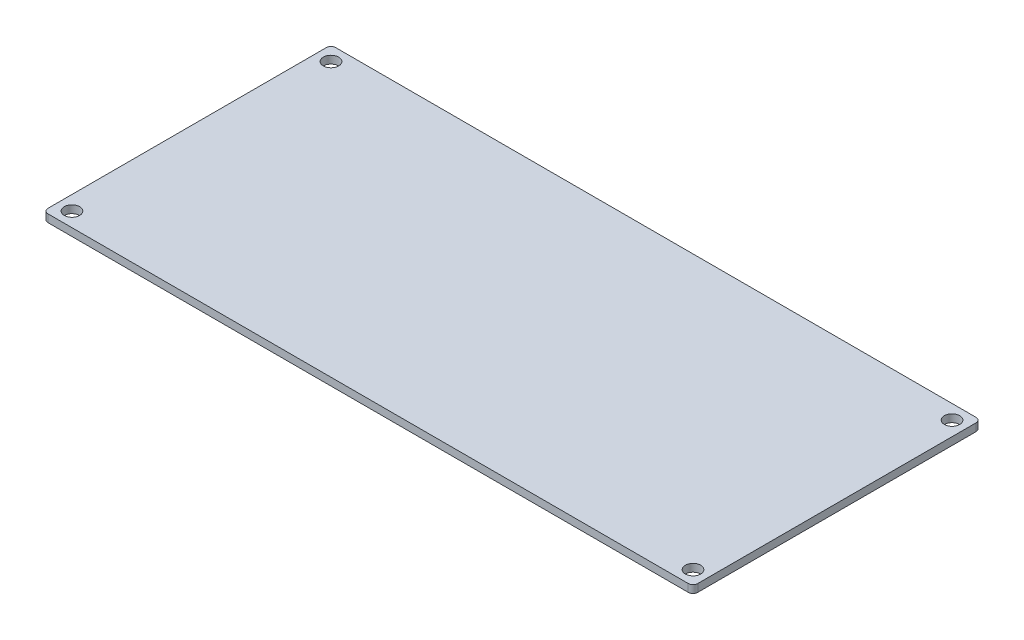
ISO-10303-21;
HEADER;
FILE_DESCRIPTION(('STEP AP214'),'2;1');
FILE_NAME('part.step','',(''),(''),'','','');
FILE_SCHEMA(('AUTOMOTIVE_DESIGN { 1 0 10303 214 1 1 1 1 }'));
ENDSEC;
DATA;
#1=APPLICATION_CONTEXT('core data for automotive mechanical design processes');
#2=APPLICATION_PROTOCOL_DEFINITION('international standard','automotive_design',2000,#1);
#3=PRODUCT_CONTEXT('',#1,'mechanical');
#4=PRODUCT('Part','Part','',(#3));
#5=PRODUCT_RELATED_PRODUCT_CATEGORY('part','',(#4));
#6=PRODUCT_DEFINITION_FORMATION('','',#4);
#7=PRODUCT_DEFINITION_CONTEXT('part definition',#1,'design');
#8=PRODUCT_DEFINITION('design','',#6,#7);
#9=PRODUCT_DEFINITION_SHAPE('','',#8);
#10=(LENGTH_UNIT() NAMED_UNIT(*) SI_UNIT(.MILLI.,.METRE.));
#11=(NAMED_UNIT(*) PLANE_ANGLE_UNIT() SI_UNIT($,.RADIAN.));
#12=(NAMED_UNIT(*) SI_UNIT($,.STERADIAN.) SOLID_ANGLE_UNIT());
#13=UNCERTAINTY_MEASURE_WITH_UNIT(LENGTH_MEASURE(1.E-05),#10,'distance_accuracy_value','');
#14=(GEOMETRIC_REPRESENTATION_CONTEXT(3) GLOBAL_UNCERTAINTY_ASSIGNED_CONTEXT((#13)) GLOBAL_UNIT_ASSIGNED_CONTEXT((#10,
#11,#12)) REPRESENTATION_CONTEXT('',''));
#15=CARTESIAN_POINT('',(0.,0.,0.));
#16=DIRECTION('',(0.,0.,1.));
#17=DIRECTION('',(1.,0.,0.));
#18=AXIS2_PLACEMENT_3D('',#15,#16,#17);
#19=CARTESIAN_POINT('',(67.735,1.6,-30.));
#20=DIRECTION('',(-1.,0.,0.));
#21=DIRECTION('',(0.,0.,1.));
#22=AXIS2_PLACEMENT_3D('',#19,#20,#21);
#23=PLANE('',#22);
#24=DIRECTION('',(0.,0.,-1.));
#25=VECTOR('',#24,1.);
#26=CARTESIAN_POINT('',(67.735,0.,-30.));
#27=LINE('',#26,#25);
#28=CARTESIAN_POINT('',(67.735,0.,29.));
#29=VERTEX_POINT('',#28);
#30=CARTESIAN_POINT('',(67.735,0.,-29.));
#31=VERTEX_POINT('',#30);
#32=EDGE_CURVE('E135',#29,#31,#27,.T.);
#33=ORIENTED_EDGE('',*,*,#32,.T.);
#34=DIRECTION('',(0.,-1.,0.));
#35=VECTOR('',#34,1.);
#36=CARTESIAN_POINT('',(67.735,1.6,-29.));
#37=LINE('',#36,#35);
#38=CARTESIAN_POINT('',(67.735,1.6,-29.));
#39=VERTEX_POINT('',#38);
#40=EDGE_CURVE('E109',#31,#39,#37,.F.);
#41=ORIENTED_EDGE('',*,*,#40,.T.);
#42=DIRECTION('',(0.,0.,-1.));
#43=VECTOR('',#42,1.);
#44=CARTESIAN_POINT('',(67.735,1.6,-30.));
#45=LINE('',#44,#43);
#46=CARTESIAN_POINT('',(67.735,1.6,29.));
#47=VERTEX_POINT('',#46);
#48=EDGE_CURVE('E142',#47,#39,#45,.T.);
#49=ORIENTED_EDGE('',*,*,#48,.F.);
#50=DIRECTION('',(0.,-1.,0.));
#51=VECTOR('',#50,1.);
#52=CARTESIAN_POINT('',(67.735,1.6,29.));
#53=LINE('',#52,#51);
#54=EDGE_CURVE('E113',#47,#29,#53,.T.);
#55=ORIENTED_EDGE('',*,*,#54,.T.);
#56=EDGE_LOOP('',(#33,#41,#49,#55));
#57=FACE_BOUND('',#56,.T.);
#58=ADVANCED_FACE('F39',(#57),#23,.F.);
#59=CARTESIAN_POINT('',(-67.735,1.6,-30.));
#60=DIRECTION('',(0.,0.,1.));
#61=DIRECTION('',(1.,0.,0.));
#62=AXIS2_PLACEMENT_3D('',#59,#60,#61);
#63=PLANE('',#62);
#64=DIRECTION('',(-1.,0.,0.));
#65=VECTOR('',#64,1.);
#66=CARTESIAN_POINT('',(-67.735,1.6,-30.));
#67=LINE('',#66,#65);
#68=CARTESIAN_POINT('',(66.735,1.6,-30.));
#69=VERTEX_POINT('',#68);
#70=CARTESIAN_POINT('',(-66.735,1.6,-30.));
#71=VERTEX_POINT('',#70);
#72=EDGE_CURVE('E121',#69,#71,#67,.T.);
#73=ORIENTED_EDGE('',*,*,#72,.F.);
#74=DIRECTION('',(0.,-1.,0.));
#75=VECTOR('',#74,1.);
#76=CARTESIAN_POINT('',(66.735,1.6,-30.));
#77=LINE('',#76,#75);
#78=CARTESIAN_POINT('',(66.735,0.,-30.));
#79=VERTEX_POINT('',#78);
#80=EDGE_CURVE('E108',#69,#79,#77,.T.);
#81=ORIENTED_EDGE('',*,*,#80,.T.);
#82=DIRECTION('',(-1.,0.,0.));
#83=VECTOR('',#82,1.);
#84=CARTESIAN_POINT('',(-67.735,0.,-30.));
#85=LINE('',#84,#83);
#86=CARTESIAN_POINT('',(-66.735,0.,-30.));
#87=VERTEX_POINT('',#86);
#88=EDGE_CURVE('E125',#79,#87,#85,.T.);
#89=ORIENTED_EDGE('',*,*,#88,.T.);
#90=DIRECTION('',(0.,-1.,0.));
#91=VECTOR('',#90,1.);
#92=CARTESIAN_POINT('',(-66.735,1.6,-30.));
#93=LINE('',#92,#91);
#94=EDGE_CURVE('E130',#87,#71,#93,.F.);
#95=ORIENTED_EDGE('',*,*,#94,.T.);
#96=EDGE_LOOP('',(#73,#81,#89,#95));
#97=FACE_BOUND('',#96,.T.);
#98=ADVANCED_FACE('F122',(#97),#63,.F.);
#99=CARTESIAN_POINT('',(-67.735,1.6,-30.));
#100=DIRECTION('',(1.,0.,0.));
#101=DIRECTION('',(0.,0.,-1.));
#102=AXIS2_PLACEMENT_3D('',#99,#100,#101);
#103=PLANE('',#102);
#104=DIRECTION('',(0.,0.,1.));
#105=VECTOR('',#104,1.);
#106=CARTESIAN_POINT('',(-67.735,0.,-30.));
#107=LINE('',#106,#105);
#108=CARTESIAN_POINT('',(-67.735,0.,-29.));
#109=VERTEX_POINT('',#108);
#110=CARTESIAN_POINT('',(-67.735,0.,29.));
#111=VERTEX_POINT('',#110);
#112=EDGE_CURVE('E133',#109,#111,#107,.T.);
#113=ORIENTED_EDGE('',*,*,#112,.T.);
#114=DIRECTION('',(0.,-1.,0.));
#115=VECTOR('',#114,1.);
#116=CARTESIAN_POINT('',(-67.735,1.6,29.));
#117=LINE('',#116,#115);
#118=CARTESIAN_POINT('',(-67.735,1.6,29.));
#119=VERTEX_POINT('',#118);
#120=EDGE_CURVE('E11',#111,#119,#117,.F.);
#121=ORIENTED_EDGE('',*,*,#120,.T.);
#122=DIRECTION('',(0.,0.,1.));
#123=VECTOR('',#122,1.);
#124=CARTESIAN_POINT('',(-67.735,1.6,-30.));
#125=LINE('',#124,#123);
#126=CARTESIAN_POINT('',(-67.735,1.6,-29.));
#127=VERTEX_POINT('',#126);
#128=EDGE_CURVE('E169',#127,#119,#125,.T.);
#129=ORIENTED_EDGE('',*,*,#128,.F.);
#130=DIRECTION('',(0.,-1.,0.));
#131=VECTOR('',#130,1.);
#132=CARTESIAN_POINT('',(-67.735,1.6,-29.));
#133=LINE('',#132,#131);
#134=EDGE_CURVE('E50',#127,#109,#133,.T.);
#135=ORIENTED_EDGE('',*,*,#134,.T.);
#136=EDGE_LOOP('',(#113,#121,#129,#135));
#137=FACE_BOUND('',#136,.T.);
#138=ADVANCED_FACE('F167',(#137),#103,.F.);
#139=CARTESIAN_POINT('',(-67.735,1.6,30.));
#140=DIRECTION('',(0.,0.,-1.));
#141=DIRECTION('',(-1.,0.,0.));
#142=AXIS2_PLACEMENT_3D('',#139,#140,#141);
#143=PLANE('',#142);
#144=DIRECTION('',(1.,0.,0.));
#145=VECTOR('',#144,1.);
#146=CARTESIAN_POINT('',(-67.735,0.,30.));
#147=LINE('',#146,#145);
#148=CARTESIAN_POINT('',(-66.735,0.,30.));
#149=VERTEX_POINT('',#148);
#150=CARTESIAN_POINT('',(66.735,0.,30.));
#151=VERTEX_POINT('',#150);
#152=EDGE_CURVE('E132',#149,#151,#147,.T.);
#153=ORIENTED_EDGE('',*,*,#152,.T.);
#154=DIRECTION('',(0.,-1.,0.));
#155=VECTOR('',#154,1.);
#156=CARTESIAN_POINT('',(66.735,1.6,30.));
#157=LINE('',#156,#155);
#158=CARTESIAN_POINT('',(66.735,1.6,30.));
#159=VERTEX_POINT('',#158);
#160=EDGE_CURVE('E53',#151,#159,#157,.F.);
#161=ORIENTED_EDGE('',*,*,#160,.T.);
#162=DIRECTION('',(1.,0.,0.));
#163=VECTOR('',#162,1.);
#164=CARTESIAN_POINT('',(-67.735,1.6,30.));
#165=LINE('',#164,#163);
#166=CARTESIAN_POINT('',(-66.735,1.6,30.));
#167=VERTEX_POINT('',#166);
#168=EDGE_CURVE('E141',#167,#159,#165,.T.);
#169=ORIENTED_EDGE('',*,*,#168,.F.);
#170=DIRECTION('',(0.,-1.,0.));
#171=VECTOR('',#170,1.);
#172=CARTESIAN_POINT('',(-66.735,1.6,30.));
#173=LINE('',#172,#171);
#174=EDGE_CURVE('E157',#167,#149,#173,.T.);
#175=ORIENTED_EDGE('',*,*,#174,.T.);
#176=EDGE_LOOP('',(#153,#161,#169,#175));
#177=FACE_BOUND('',#176,.T.);
#178=ADVANCED_FACE('F172',(#177),#143,.F.);
#179=CARTESIAN_POINT('',(0.,1.6,0.));
#180=DIRECTION('',(0.,1.,0.));
#181=DIRECTION('',(0.,0.,1.));
#182=AXIS2_PLACEMENT_3D('',#179,#180,#181);
#183=PLANE('',#182);
#184=CARTESIAN_POINT('',(-64.735,1.6,-27.));
#185=DIRECTION('',(0.,1.,0.));
#186=DIRECTION('',(0.,0.,1.));
#187=AXIS2_PLACEMENT_3D('',#184,#185,#186);
#188=CIRCLE('',#187,1.6);
#189=CARTESIAN_POINT('',(-64.735,1.6,-25.4));
#190=VERTEX_POINT('',#189);
#191=EDGE_CURVE('E205',#190,#190,#188,.T.);
#192=ORIENTED_EDGE('',*,*,#191,.F.);
#193=EDGE_LOOP('',(#192));
#194=FACE_BOUND('',#193,.T.);
#195=CARTESIAN_POINT('',(64.735,1.6,27.));
#196=DIRECTION('',(0.,1.,0.));
#197=DIRECTION('',(0.,0.,1.));
#198=AXIS2_PLACEMENT_3D('',#195,#196,#197);
#199=CIRCLE('',#198,1.6);
#200=CARTESIAN_POINT('',(64.735,1.6,28.6));
#201=VERTEX_POINT('',#200);
#202=EDGE_CURVE('E198',#201,#201,#199,.T.);
#203=ORIENTED_EDGE('',*,*,#202,.F.);
#204=EDGE_LOOP('',(#203));
#205=FACE_BOUND('',#204,.T.);
#206=CARTESIAN_POINT('',(-64.735,1.6,27.));
#207=DIRECTION('',(0.,1.,0.));
#208=DIRECTION('',(0.,0.,1.));
#209=AXIS2_PLACEMENT_3D('',#206,#207,#208);
#210=CIRCLE('',#209,1.6);
#211=CARTESIAN_POINT('',(-64.735,1.6,28.6));
#212=VERTEX_POINT('',#211);
#213=EDGE_CURVE('E187',#212,#212,#210,.T.);
#214=ORIENTED_EDGE('',*,*,#213,.F.);
#215=EDGE_LOOP('',(#214));
#216=FACE_BOUND('',#215,.T.);
#217=CARTESIAN_POINT('',(64.735,1.6,-27.));
#218=DIRECTION('',(0.,1.,0.));
#219=DIRECTION('',(0.,0.,1.));
#220=AXIS2_PLACEMENT_3D('',#217,#218,#219);
#221=CIRCLE('',#220,1.6);
#222=CARTESIAN_POINT('',(64.735,1.6,-25.4));
#223=VERTEX_POINT('',#222);
#224=EDGE_CURVE('E184',#223,#223,#221,.T.);
#225=ORIENTED_EDGE('',*,*,#224,.F.);
#226=EDGE_LOOP('',(#225));
#227=FACE_BOUND('',#226,.T.);
#228=ORIENTED_EDGE('',*,*,#48,.T.);
#229=CARTESIAN_POINT('',(66.735,1.6,-29.));
#230=DIRECTION('',(0.,1.,0.));
#231=DIRECTION('',(0.,0.,1.));
#232=AXIS2_PLACEMENT_3D('',#229,#230,#231);
#233=CIRCLE('',#232,1.);
#234=EDGE_CURVE('E160',#39,#69,#233,.T.);
#235=ORIENTED_EDGE('',*,*,#234,.T.);
#236=ORIENTED_EDGE('',*,*,#72,.T.);
#237=CARTESIAN_POINT('',(-66.735,1.6,-29.));
#238=DIRECTION('',(0.,1.,0.));
#239=DIRECTION('',(0.,0.,1.));
#240=AXIS2_PLACEMENT_3D('',#237,#238,#239);
#241=CIRCLE('',#240,1.);
#242=EDGE_CURVE('E155',#71,#127,#241,.T.);
#243=ORIENTED_EDGE('',*,*,#242,.T.);
#244=ORIENTED_EDGE('',*,*,#128,.T.);
#245=CARTESIAN_POINT('',(-66.735,1.6,29.));
#246=DIRECTION('',(0.,1.,0.));
#247=DIRECTION('',(0.,0.,1.));
#248=AXIS2_PLACEMENT_3D('',#245,#246,#247);
#249=CIRCLE('',#248,1.);
#250=EDGE_CURVE('E63',#119,#167,#249,.T.);
#251=ORIENTED_EDGE('',*,*,#250,.T.);
#252=ORIENTED_EDGE('',*,*,#168,.T.);
#253=CARTESIAN_POINT('',(66.735,1.6,29.));
#254=DIRECTION('',(0.,1.,0.));
#255=DIRECTION('',(0.,0.,1.));
#256=AXIS2_PLACEMENT_3D('',#253,#254,#255);
#257=CIRCLE('',#256,1.);
#258=EDGE_CURVE('E154',#159,#47,#257,.T.);
#259=ORIENTED_EDGE('',*,*,#258,.T.);
#260=EDGE_LOOP('',(#228,#235,#236,#243,#244,#251,#252,#259));
#261=FACE_BOUND('',#260,.T.);
#262=ADVANCED_FACE('F208',(#194,#205,#216,#227,#261),#183,.T.);
#263=CARTESIAN_POINT('',(0.,0.,0.));
#264=DIRECTION('',(0.,1.,0.));
#265=DIRECTION('',(0.,0.,1.));
#266=AXIS2_PLACEMENT_3D('',#263,#264,#265);
#267=PLANE('',#266);
#268=CARTESIAN_POINT('',(-64.735,0.,-27.));
#269=DIRECTION('',(0.,1.,0.));
#270=DIRECTION('',(0.,0.,1.));
#271=AXIS2_PLACEMENT_3D('',#268,#269,#270);
#272=CIRCLE('',#271,1.6);
#273=CARTESIAN_POINT('',(-64.735,0.,-25.4));
#274=VERTEX_POINT('',#273);
#275=EDGE_CURVE('E200',#274,#274,#272,.T.);
#276=ORIENTED_EDGE('',*,*,#275,.T.);
#277=EDGE_LOOP('',(#276));
#278=FACE_BOUND('',#277,.T.);
#279=CARTESIAN_POINT('',(64.735,0.,27.));
#280=DIRECTION('',(0.,1.,0.));
#281=DIRECTION('',(0.,0.,1.));
#282=AXIS2_PLACEMENT_3D('',#279,#280,#281);
#283=CIRCLE('',#282,1.6);
#284=CARTESIAN_POINT('',(64.735,0.,28.6));
#285=VERTEX_POINT('',#284);
#286=EDGE_CURVE('E193',#285,#285,#283,.T.);
#287=ORIENTED_EDGE('',*,*,#286,.T.);
#288=EDGE_LOOP('',(#287));
#289=FACE_BOUND('',#288,.T.);
#290=CARTESIAN_POINT('',(-64.735,0.,27.));
#291=DIRECTION('',(0.,1.,0.));
#292=DIRECTION('',(0.,0.,1.));
#293=AXIS2_PLACEMENT_3D('',#290,#291,#292);
#294=CIRCLE('',#293,1.6);
#295=CARTESIAN_POINT('',(-64.735,0.,28.6));
#296=VERTEX_POINT('',#295);
#297=EDGE_CURVE('E190',#296,#296,#294,.T.);
#298=ORIENTED_EDGE('',*,*,#297,.T.);
#299=EDGE_LOOP('',(#298));
#300=FACE_BOUND('',#299,.T.);
#301=CARTESIAN_POINT('',(64.735,0.,-27.));
#302=DIRECTION('',(0.,1.,0.));
#303=DIRECTION('',(0.,0.,1.));
#304=AXIS2_PLACEMENT_3D('',#301,#302,#303);
#305=CIRCLE('',#304,1.6);
#306=CARTESIAN_POINT('',(64.735,0.,-25.4));
#307=VERTEX_POINT('',#306);
#308=EDGE_CURVE('E140',#307,#307,#305,.T.);
#309=ORIENTED_EDGE('',*,*,#308,.T.);
#310=EDGE_LOOP('',(#309));
#311=FACE_BOUND('',#310,.T.);
#312=ORIENTED_EDGE('',*,*,#88,.F.);
#313=CARTESIAN_POINT('',(66.735,0.,-29.));
#314=DIRECTION('',(0.,1.,0.));
#315=DIRECTION('',(0.,0.,1.));
#316=AXIS2_PLACEMENT_3D('',#313,#314,#315);
#317=CIRCLE('',#316,1.);
#318=EDGE_CURVE('E104',#79,#31,#317,.F.);
#319=ORIENTED_EDGE('',*,*,#318,.T.);
#320=ORIENTED_EDGE('',*,*,#32,.F.);
#321=CARTESIAN_POINT('',(66.735,0.,29.));
#322=DIRECTION('',(0.,1.,0.));
#323=DIRECTION('',(0.,0.,1.));
#324=AXIS2_PLACEMENT_3D('',#321,#322,#323);
#325=CIRCLE('',#324,1.);
#326=EDGE_CURVE('E118',#29,#151,#325,.F.);
#327=ORIENTED_EDGE('',*,*,#326,.T.);
#328=ORIENTED_EDGE('',*,*,#152,.F.);
#329=CARTESIAN_POINT('',(-66.735,0.,29.));
#330=DIRECTION('',(0.,1.,0.));
#331=DIRECTION('',(0.,0.,1.));
#332=AXIS2_PLACEMENT_3D('',#329,#330,#331);
#333=CIRCLE('',#332,1.);
#334=EDGE_CURVE('E148',#149,#111,#333,.F.);
#335=ORIENTED_EDGE('',*,*,#334,.T.);
#336=ORIENTED_EDGE('',*,*,#112,.F.);
#337=CARTESIAN_POINT('',(-66.735,0.,-29.));
#338=DIRECTION('',(0.,1.,0.));
#339=DIRECTION('',(0.,0.,1.));
#340=AXIS2_PLACEMENT_3D('',#337,#338,#339);
#341=CIRCLE('',#340,1.);
#342=EDGE_CURVE('E127',#109,#87,#341,.F.);
#343=ORIENTED_EDGE('',*,*,#342,.T.);
#344=EDGE_LOOP('',(#312,#319,#320,#327,#328,#335,#336,#343));
#345=FACE_BOUND('',#344,.T.);
#346=ADVANCED_FACE('F129',(#278,#289,#300,#311,#345),#267,.F.);
#347=CARTESIAN_POINT('',(64.735,1.6,-27.));
#348=DIRECTION('',(0.,1.,0.));
#349=DIRECTION('',(0.,0.,1.));
#350=AXIS2_PLACEMENT_3D('',#347,#348,#349);
#351=CYLINDRICAL_SURFACE('',#350,1.6);
#352=ORIENTED_EDGE('',*,*,#308,.F.);
#353=EDGE_LOOP('',(#352));
#354=FACE_BOUND('',#353,.T.);
#355=ORIENTED_EDGE('',*,*,#224,.T.);
#356=EDGE_LOOP('',(#355));
#357=FACE_BOUND('',#356,.T.);
#358=ADVANCED_FACE('F245',(#354,#357),#351,.F.);
#359=CARTESIAN_POINT('',(-64.735,1.6,27.));
#360=DIRECTION('',(0.,1.,0.));
#361=DIRECTION('',(0.,0.,1.));
#362=AXIS2_PLACEMENT_3D('',#359,#360,#361);
#363=CYLINDRICAL_SURFACE('',#362,1.6);
#364=ORIENTED_EDGE('',*,*,#297,.F.);
#365=EDGE_LOOP('',(#364));
#366=FACE_BOUND('',#365,.T.);
#367=ORIENTED_EDGE('',*,*,#213,.T.);
#368=EDGE_LOOP('',(#367));
#369=FACE_BOUND('',#368,.T.);
#370=ADVANCED_FACE('F250',(#366,#369),#363,.F.);
#371=CARTESIAN_POINT('',(64.735,1.6,27.));
#372=DIRECTION('',(0.,1.,0.));
#373=DIRECTION('',(0.,0.,1.));
#374=AXIS2_PLACEMENT_3D('',#371,#372,#373);
#375=CYLINDRICAL_SURFACE('',#374,1.6);
#376=ORIENTED_EDGE('',*,*,#286,.F.);
#377=EDGE_LOOP('',(#376));
#378=FACE_BOUND('',#377,.T.);
#379=ORIENTED_EDGE('',*,*,#202,.T.);
#380=EDGE_LOOP('',(#379));
#381=FACE_BOUND('',#380,.T.);
#382=ADVANCED_FACE('F253',(#378,#381),#375,.F.);
#383=CARTESIAN_POINT('',(-64.735,1.6,-27.));
#384=DIRECTION('',(0.,1.,0.));
#385=DIRECTION('',(0.,0.,1.));
#386=AXIS2_PLACEMENT_3D('',#383,#384,#385);
#387=CYLINDRICAL_SURFACE('',#386,1.6);
#388=ORIENTED_EDGE('',*,*,#275,.F.);
#389=EDGE_LOOP('',(#388));
#390=FACE_BOUND('',#389,.T.);
#391=ORIENTED_EDGE('',*,*,#191,.T.);
#392=EDGE_LOOP('',(#391));
#393=FACE_BOUND('',#392,.T.);
#394=ADVANCED_FACE('F206',(#390,#393),#387,.F.);
#395=CARTESIAN_POINT('',(66.735,1.6,-29.));
#396=DIRECTION('',(0.,-1.,0.));
#397=DIRECTION('',(0.,0.,-1.));
#398=AXIS2_PLACEMENT_3D('',#395,#396,#397);
#399=CYLINDRICAL_SURFACE('',#398,1.);
#400=ORIENTED_EDGE('',*,*,#234,.F.);
#401=ORIENTED_EDGE('',*,*,#40,.F.);
#402=ORIENTED_EDGE('',*,*,#318,.F.);
#403=ORIENTED_EDGE('',*,*,#80,.F.);
#404=EDGE_LOOP('',(#400,#401,#402,#403));
#405=FACE_BOUND('',#404,.T.);
#406=ADVANCED_FACE('F107',(#405),#399,.T.);
#407=CARTESIAN_POINT('',(66.735,1.6,29.));
#408=DIRECTION('',(0.,-1.,0.));
#409=DIRECTION('',(0.,0.,-1.));
#410=AXIS2_PLACEMENT_3D('',#407,#408,#409);
#411=CYLINDRICAL_SURFACE('',#410,1.);
#412=ORIENTED_EDGE('',*,*,#258,.F.);
#413=ORIENTED_EDGE('',*,*,#160,.F.);
#414=ORIENTED_EDGE('',*,*,#326,.F.);
#415=ORIENTED_EDGE('',*,*,#54,.F.);
#416=EDGE_LOOP('',(#412,#413,#414,#415));
#417=FACE_BOUND('',#416,.T.);
#418=ADVANCED_FACE('F222',(#417),#411,.T.);
#419=CARTESIAN_POINT('',(-66.735,1.6,29.));
#420=DIRECTION('',(0.,-1.,0.));
#421=DIRECTION('',(0.,0.,-1.));
#422=AXIS2_PLACEMENT_3D('',#419,#420,#421);
#423=CYLINDRICAL_SURFACE('',#422,1.);
#424=ORIENTED_EDGE('',*,*,#250,.F.);
#425=ORIENTED_EDGE('',*,*,#120,.F.);
#426=ORIENTED_EDGE('',*,*,#334,.F.);
#427=ORIENTED_EDGE('',*,*,#174,.F.);
#428=EDGE_LOOP('',(#424,#425,#426,#427));
#429=FACE_BOUND('',#428,.T.);
#430=ADVANCED_FACE('F174',(#429),#423,.T.);
#431=CARTESIAN_POINT('',(-66.735,1.6,-29.));
#432=DIRECTION('',(0.,-1.,0.));
#433=DIRECTION('',(0.,0.,-1.));
#434=AXIS2_PLACEMENT_3D('',#431,#432,#433);
#435=CYLINDRICAL_SURFACE('',#434,1.);
#436=ORIENTED_EDGE('',*,*,#242,.F.);
#437=ORIENTED_EDGE('',*,*,#94,.F.);
#438=ORIENTED_EDGE('',*,*,#342,.F.);
#439=ORIENTED_EDGE('',*,*,#134,.F.);
#440=EDGE_LOOP('',(#436,#437,#438,#439));
#441=FACE_BOUND('',#440,.T.);
#442=ADVANCED_FACE('F41',(#441),#435,.T.);
#443=CLOSED_SHELL('',(#58,#98,#138,#178,#262,#346,#358,#370,#382,#394,#406,#418,#430,#442));
#444=MANIFOLD_SOLID_BREP('B2',#443);
#445=ADVANCED_BREP_SHAPE_REPRESENTATION('',(#18,#444),#14);
#446=SHAPE_DEFINITION_REPRESENTATION(#9,#445);
ENDSEC;
END-ISO-10303-21;
